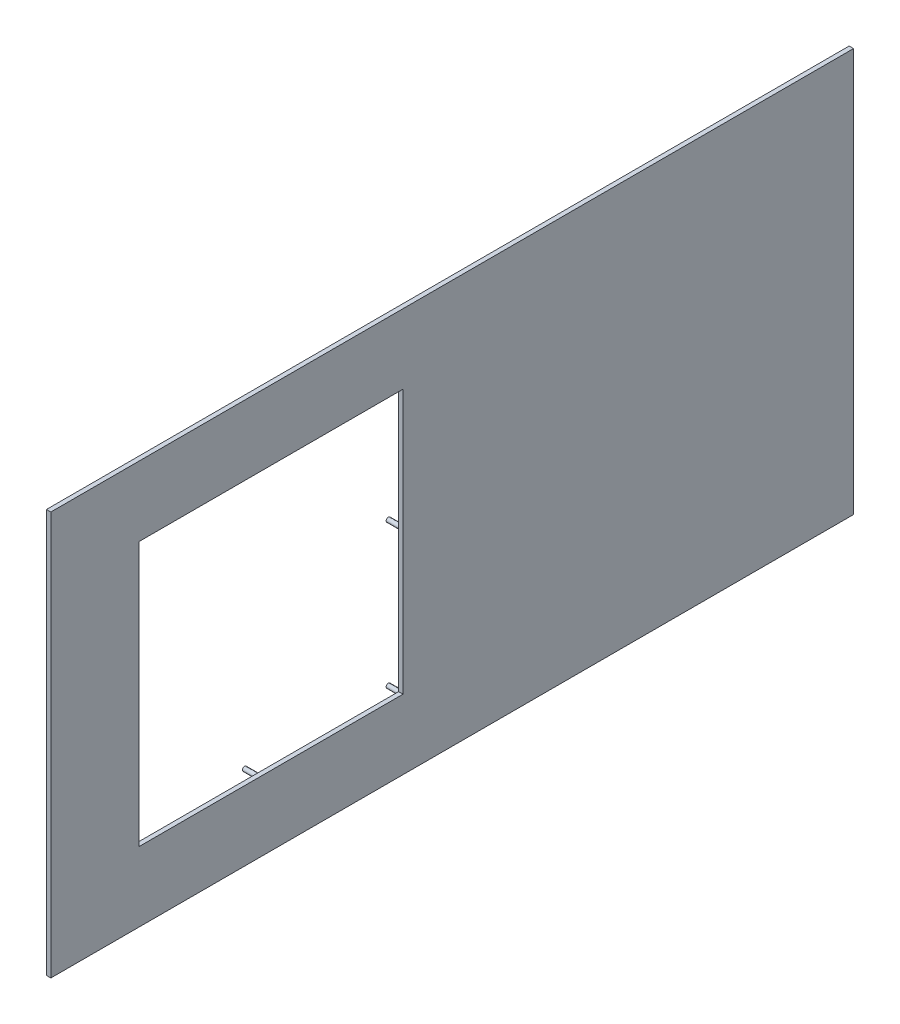
ISO-10303-21;
HEADER;
FILE_DESCRIPTION(('STEP AP214'),'2;1');
FILE_NAME('part.step','',(''),(''),'','','');
FILE_SCHEMA(('AUTOMOTIVE_DESIGN { 1 0 10303 214 1 1 1 1 }'));
ENDSEC;
DATA;
#1=APPLICATION_CONTEXT('core data for automotive mechanical design processes');
#2=APPLICATION_PROTOCOL_DEFINITION('international standard','automotive_design',2000,#1);
#3=PRODUCT_CONTEXT('',#1,'mechanical');
#4=PRODUCT('Part','Part','',(#3));
#5=PRODUCT_RELATED_PRODUCT_CATEGORY('part','',(#4));
#6=PRODUCT_DEFINITION_FORMATION('','',#4);
#7=PRODUCT_DEFINITION_CONTEXT('part definition',#1,'design');
#8=PRODUCT_DEFINITION('design','',#6,#7);
#9=PRODUCT_DEFINITION_SHAPE('','',#8);
#10=(LENGTH_UNIT() NAMED_UNIT(*) SI_UNIT(.MILLI.,.METRE.));
#11=(NAMED_UNIT(*) PLANE_ANGLE_UNIT() SI_UNIT($,.RADIAN.));
#12=(NAMED_UNIT(*) SI_UNIT($,.STERADIAN.) SOLID_ANGLE_UNIT());
#13=UNCERTAINTY_MEASURE_WITH_UNIT(LENGTH_MEASURE(1.E-05),#10,'distance_accuracy_value','');
#14=(GEOMETRIC_REPRESENTATION_CONTEXT(3) GLOBAL_UNCERTAINTY_ASSIGNED_CONTEXT((#13)) GLOBAL_UNIT_ASSIGNED_CONTEXT((#10,
#11,#12)) REPRESENTATION_CONTEXT('',''));
#15=CARTESIAN_POINT('',(0.,0.,0.));
#16=DIRECTION('',(0.,0.,1.));
#17=DIRECTION('',(1.,0.,0.));
#18=AXIS2_PLACEMENT_3D('',#15,#16,#17);
#19=CARTESIAN_POINT('',(3.,-137.5,-273.5));
#20=DIRECTION('',(0.,0.,1.));
#21=DIRECTION('',(1.,0.,0.));
#22=AXIS2_PLACEMENT_3D('',#19,#20,#21);
#23=PLANE('',#22);
#24=DIRECTION('',(0.,1.,0.));
#25=VECTOR('',#24,1.);
#26=CARTESIAN_POINT('',(0.,-137.5,-273.5));
#27=LINE('',#26,#25);
#28=CARTESIAN_POINT('',(0.,-137.5,-273.5));
#29=VERTEX_POINT('',#28);
#30=CARTESIAN_POINT('',(0.,137.5,-273.5));
#31=VERTEX_POINT('',#30);
#32=EDGE_CURVE('E151',#29,#31,#27,.T.);
#33=ORIENTED_EDGE('',*,*,#32,.T.);
#34=DIRECTION('',(-1.,0.,0.));
#35=VECTOR('',#34,1.);
#36=CARTESIAN_POINT('',(3.,137.5,-273.5));
#37=LINE('',#36,#35);
#38=CARTESIAN_POINT('',(3.,137.5,-273.5));
#39=VERTEX_POINT('',#38);
#40=EDGE_CURVE('E11',#39,#31,#37,.T.);
#41=ORIENTED_EDGE('',*,*,#40,.F.);
#42=DIRECTION('',(0.,1.,0.));
#43=VECTOR('',#42,1.);
#44=CARTESIAN_POINT('',(3.,-137.5,-273.5));
#45=LINE('',#44,#43);
#46=CARTESIAN_POINT('',(3.,-137.5,-273.5));
#47=VERTEX_POINT('',#46);
#48=EDGE_CURVE('E157',#47,#39,#45,.T.);
#49=ORIENTED_EDGE('',*,*,#48,.F.);
#50=DIRECTION('',(-1.,0.,0.));
#51=VECTOR('',#50,1.);
#52=CARTESIAN_POINT('',(3.,-137.5,-273.5));
#53=LINE('',#52,#51);
#54=EDGE_CURVE('E171',#47,#29,#53,.T.);
#55=ORIENTED_EDGE('',*,*,#54,.T.);
#56=EDGE_LOOP('',(#33,#41,#49,#55));
#57=FACE_BOUND('',#56,.T.);
#58=ADVANCED_FACE('F38',(#57),#23,.F.);
#59=CARTESIAN_POINT('',(3.,137.5,273.5));
#60=DIRECTION('',(0.,-1.,0.));
#61=DIRECTION('',(0.,0.,-1.));
#62=AXIS2_PLACEMENT_3D('',#59,#60,#61);
#63=PLANE('',#62);
#64=DIRECTION('',(0.,0.,1.));
#65=VECTOR('',#64,1.);
#66=CARTESIAN_POINT('',(0.,137.5,273.5));
#67=LINE('',#66,#65);
#68=CARTESIAN_POINT('',(0.,137.5,273.5));
#69=VERTEX_POINT('',#68);
#70=EDGE_CURVE('E175',#31,#69,#67,.T.);
#71=ORIENTED_EDGE('',*,*,#70,.T.);
#72=DIRECTION('',(-1.,0.,0.));
#73=VECTOR('',#72,1.);
#74=CARTESIAN_POINT('',(3.,137.5,273.5));
#75=LINE('',#74,#73);
#76=CARTESIAN_POINT('',(3.,137.5,273.5));
#77=VERTEX_POINT('',#76);
#78=EDGE_CURVE('E46',#77,#69,#75,.T.);
#79=ORIENTED_EDGE('',*,*,#78,.F.);
#80=DIRECTION('',(0.,0.,1.));
#81=VECTOR('',#80,1.);
#82=CARTESIAN_POINT('',(3.,137.5,273.5));
#83=LINE('',#82,#81);
#84=EDGE_CURVE('E161',#39,#77,#83,.T.);
#85=ORIENTED_EDGE('',*,*,#84,.F.);
#86=ORIENTED_EDGE('',*,*,#40,.T.);
#87=EDGE_LOOP('',(#71,#79,#85,#86));
#88=FACE_BOUND('',#87,.T.);
#89=ADVANCED_FACE('F210',(#88),#63,.F.);
#90=CARTESIAN_POINT('',(3.,-137.5,273.5));
#91=DIRECTION('',(0.,0.,-1.));
#92=DIRECTION('',(-1.,0.,0.));
#93=AXIS2_PLACEMENT_3D('',#90,#91,#92);
#94=PLANE('',#93);
#95=DIRECTION('',(0.,-1.,0.));
#96=VECTOR('',#95,1.);
#97=CARTESIAN_POINT('',(0.,-137.5,273.5));
#98=LINE('',#97,#96);
#99=CARTESIAN_POINT('',(0.,-137.5,273.5));
#100=VERTEX_POINT('',#99);
#101=EDGE_CURVE('E178',#69,#100,#98,.T.);
#102=ORIENTED_EDGE('',*,*,#101,.T.);
#103=DIRECTION('',(-1.,0.,0.));
#104=VECTOR('',#103,1.);
#105=CARTESIAN_POINT('',(3.,-137.5,273.5));
#106=LINE('',#105,#104);
#107=CARTESIAN_POINT('',(3.,-137.5,273.5));
#108=VERTEX_POINT('',#107);
#109=EDGE_CURVE('E186',#108,#100,#106,.T.);
#110=ORIENTED_EDGE('',*,*,#109,.F.);
#111=DIRECTION('',(0.,-1.,0.));
#112=VECTOR('',#111,1.);
#113=CARTESIAN_POINT('',(3.,-137.5,273.5));
#114=LINE('',#113,#112);
#115=EDGE_CURVE('E165',#77,#108,#114,.T.);
#116=ORIENTED_EDGE('',*,*,#115,.F.);
#117=ORIENTED_EDGE('',*,*,#78,.T.);
#118=EDGE_LOOP('',(#102,#110,#116,#117));
#119=FACE_BOUND('',#118,.T.);
#120=ADVANCED_FACE('F196',(#119),#94,.F.);
#121=CARTESIAN_POINT('',(3.,-137.5,273.5));
#122=DIRECTION('',(0.,1.,0.));
#123=DIRECTION('',(0.,0.,1.));
#124=AXIS2_PLACEMENT_3D('',#121,#122,#123);
#125=PLANE('',#124);
#126=DIRECTION('',(0.,0.,-1.));
#127=VECTOR('',#126,1.);
#128=CARTESIAN_POINT('',(0.,-137.5,273.5));
#129=LINE('',#128,#127);
#130=EDGE_CURVE('E162',#100,#29,#129,.T.);
#131=ORIENTED_EDGE('',*,*,#130,.T.);
#132=ORIENTED_EDGE('',*,*,#54,.F.);
#133=DIRECTION('',(0.,0.,-1.));
#134=VECTOR('',#133,1.);
#135=CARTESIAN_POINT('',(3.,-137.5,273.5));
#136=LINE('',#135,#134);
#137=EDGE_CURVE('E168',#108,#47,#136,.T.);
#138=ORIENTED_EDGE('',*,*,#137,.F.);
#139=ORIENTED_EDGE('',*,*,#109,.T.);
#140=EDGE_LOOP('',(#131,#132,#138,#139));
#141=FACE_BOUND('',#140,.T.);
#142=ADVANCED_FACE('F203',(#141),#125,.F.);
#143=CARTESIAN_POINT('',(3.,0.,0.));
#144=DIRECTION('',(-1.,0.,0.));
#145=DIRECTION('',(0.,0.,1.));
#146=AXIS2_PLACEMENT_3D('',#143,#144,#145);
#147=PLANE('',#146);
#148=DIRECTION('',(0.,0.,-1.));
#149=VECTOR('',#148,1.);
#150=CARTESIAN_POINT('',(3.,-90.0000000000001,213.5));
#151=LINE('',#150,#149);
#152=CARTESIAN_POINT('',(3.,-90.0000000000001,213.5));
#153=VERTEX_POINT('',#152);
#154=CARTESIAN_POINT('',(3.,-90.0000000000001,33.5000000000001));
#155=VERTEX_POINT('',#154);
#156=EDGE_CURVE('E141',#153,#155,#151,.T.);
#157=ORIENTED_EDGE('',*,*,#156,.F.);
#158=DIRECTION('',(0.,-1.,0.));
#159=VECTOR('',#158,1.);
#160=CARTESIAN_POINT('',(3.,-90.0000000000001,213.5));
#161=LINE('',#160,#159);
#162=CARTESIAN_POINT('',(3.,90.0000000000001,213.5));
#163=VERTEX_POINT('',#162);
#164=EDGE_CURVE('E53',#163,#153,#161,.T.);
#165=ORIENTED_EDGE('',*,*,#164,.F.);
#166=DIRECTION('',(0.,0.,1.));
#167=VECTOR('',#166,1.);
#168=CARTESIAN_POINT('',(3.,90.0000000000001,213.5));
#169=LINE('',#168,#167);
#170=CARTESIAN_POINT('',(3.,90.0000000000001,33.5000000000001));
#171=VERTEX_POINT('',#170);
#172=EDGE_CURVE('E124',#171,#163,#169,.T.);
#173=ORIENTED_EDGE('',*,*,#172,.F.);
#174=DIRECTION('',(0.,1.,0.));
#175=VECTOR('',#174,1.);
#176=CARTESIAN_POINT('',(3.,-90.0000000000001,33.5000000000001));
#177=LINE('',#176,#175);
#178=EDGE_CURVE('E129',#155,#171,#177,.T.);
#179=ORIENTED_EDGE('',*,*,#178,.F.);
#180=EDGE_LOOP('',(#157,#165,#173,#179));
#181=FACE_BOUND('',#180,.T.);
#182=ORIENTED_EDGE('',*,*,#48,.T.);
#183=ORIENTED_EDGE('',*,*,#84,.T.);
#184=ORIENTED_EDGE('',*,*,#115,.T.);
#185=ORIENTED_EDGE('',*,*,#137,.T.);
#186=EDGE_LOOP('',(#182,#183,#184,#185));
#187=FACE_BOUND('',#186,.T.);
#188=ADVANCED_FACE('F209',(#181,#187),#147,.F.);
#189=CARTESIAN_POINT('',(0.,0.,0.));
#190=DIRECTION('',(-1.,0.,0.));
#191=DIRECTION('',(0.,0.,1.));
#192=AXIS2_PLACEMENT_3D('',#189,#190,#191);
#193=PLANE('',#192);
#194=CARTESIAN_POINT('',(0.,0.,221.5));
#195=DIRECTION('',(-1.,0.,0.));
#196=DIRECTION('',(0.,0.,1.));
#197=AXIS2_PLACEMENT_3D('',#194,#195,#196);
#198=CIRCLE('',#197,1.5);
#199=CARTESIAN_POINT('',(0.,0.,223.));
#200=VERTEX_POINT('',#199);
#201=EDGE_CURVE('E307',#200,#200,#198,.T.);
#202=ORIENTED_EDGE('',*,*,#201,.F.);
#203=EDGE_LOOP('',(#202));
#204=FACE_BOUND('',#203,.T.);
#205=CARTESIAN_POINT('',(0.,0.,25.5000000000001));
#206=DIRECTION('',(-1.,0.,0.));
#207=DIRECTION('',(0.,0.,1.));
#208=AXIS2_PLACEMENT_3D('',#205,#206,#207);
#209=CIRCLE('',#208,1.5);
#210=CARTESIAN_POINT('',(0.,0.,27.0000000000001));
#211=VERTEX_POINT('',#210);
#212=EDGE_CURVE('E306',#211,#211,#209,.T.);
#213=ORIENTED_EDGE('',*,*,#212,.F.);
#214=EDGE_LOOP('',(#213));
#215=FACE_BOUND('',#214,.T.);
#216=CARTESIAN_POINT('',(0.,-98.0000000000001,25.5000000000001));
#217=DIRECTION('',(-1.,0.,0.));
#218=DIRECTION('',(0.,0.,1.));
#219=AXIS2_PLACEMENT_3D('',#216,#217,#218);
#220=CIRCLE('',#219,1.5);
#221=CARTESIAN_POINT('',(0.,-98.0000000000001,27.0000000000001));
#222=VERTEX_POINT('',#221);
#223=EDGE_CURVE('E320',#222,#222,#220,.T.);
#224=ORIENTED_EDGE('',*,*,#223,.F.);
#225=EDGE_LOOP('',(#224));
#226=FACE_BOUND('',#225,.T.);
#227=CARTESIAN_POINT('',(0.,-98.0000000000001,123.5));
#228=DIRECTION('',(-1.,0.,0.));
#229=DIRECTION('',(0.,0.,1.));
#230=AXIS2_PLACEMENT_3D('',#227,#228,#229);
#231=CIRCLE('',#230,1.49999999999997);
#232=CARTESIAN_POINT('',(0.,-98.0000000000001,125.));
#233=VERTEX_POINT('',#232);
#234=EDGE_CURVE('E326',#233,#233,#231,.T.);
#235=ORIENTED_EDGE('',*,*,#234,.F.);
#236=EDGE_LOOP('',(#235));
#237=FACE_BOUND('',#236,.T.);
#238=CARTESIAN_POINT('',(0.,98.0000000000001,221.5));
#239=DIRECTION('',(-1.,0.,0.));
#240=DIRECTION('',(0.,0.,1.));
#241=AXIS2_PLACEMENT_3D('',#238,#239,#240);
#242=CIRCLE('',#241,1.5);
#243=CARTESIAN_POINT('',(0.,98.0000000000001,223.));
#244=VERTEX_POINT('',#243);
#245=EDGE_CURVE('E334',#244,#244,#242,.T.);
#246=ORIENTED_EDGE('',*,*,#245,.F.);
#247=EDGE_LOOP('',(#246));
#248=FACE_BOUND('',#247,.T.);
#249=CARTESIAN_POINT('',(0.,-98.0000000000001,221.5));
#250=DIRECTION('',(-1.,0.,0.));
#251=DIRECTION('',(0.,0.,1.));
#252=AXIS2_PLACEMENT_3D('',#249,#250,#251);
#253=CIRCLE('',#252,1.5);
#254=CARTESIAN_POINT('',(0.,-98.0000000000001,223.));
#255=VERTEX_POINT('',#254);
#256=EDGE_CURVE('E342',#255,#255,#253,.T.);
#257=ORIENTED_EDGE('',*,*,#256,.F.);
#258=EDGE_LOOP('',(#257));
#259=FACE_BOUND('',#258,.T.);
#260=CARTESIAN_POINT('',(0.,98.0000000000001,123.5));
#261=DIRECTION('',(-1.,0.,0.));
#262=DIRECTION('',(0.,0.,1.));
#263=AXIS2_PLACEMENT_3D('',#260,#261,#262);
#264=CIRCLE('',#263,1.5);
#265=CARTESIAN_POINT('',(0.,98.0000000000001,125.));
#266=VERTEX_POINT('',#265);
#267=EDGE_CURVE('E350',#266,#266,#264,.T.);
#268=ORIENTED_EDGE('',*,*,#267,.F.);
#269=EDGE_LOOP('',(#268));
#270=FACE_BOUND('',#269,.T.);
#271=CARTESIAN_POINT('',(0.,97.9999999999999,25.5000000000001));
#272=DIRECTION('',(-1.,0.,0.));
#273=DIRECTION('',(0.,0.,1.));
#274=AXIS2_PLACEMENT_3D('',#271,#272,#273);
#275=CIRCLE('',#274,1.5);
#276=CARTESIAN_POINT('',(0.,97.9999999999999,27.0000000000001));
#277=VERTEX_POINT('',#276);
#278=EDGE_CURVE('E132',#277,#277,#275,.T.);
#279=ORIENTED_EDGE('',*,*,#278,.F.);
#280=EDGE_LOOP('',(#279));
#281=FACE_BOUND('',#280,.T.);
#282=DIRECTION('',(0.,-1.,0.));
#283=VECTOR('',#282,1.);
#284=CARTESIAN_POINT('',(0.,-90.0000000000001,213.5));
#285=LINE('',#284,#283);
#286=CARTESIAN_POINT('',(0.,90.0000000000001,213.5));
#287=VERTEX_POINT('',#286);
#288=CARTESIAN_POINT('',(0.,-90.0000000000001,213.5));
#289=VERTEX_POINT('',#288);
#290=EDGE_CURVE('E105',#287,#289,#285,.T.);
#291=ORIENTED_EDGE('',*,*,#290,.T.);
#292=DIRECTION('',(0.,0.,-1.));
#293=VECTOR('',#292,1.);
#294=CARTESIAN_POINT('',(0.,-90.0000000000001,213.5));
#295=LINE('',#294,#293);
#296=CARTESIAN_POINT('',(0.,-90.0000000000001,33.5000000000001));
#297=VERTEX_POINT('',#296);
#298=EDGE_CURVE('E115',#289,#297,#295,.T.);
#299=ORIENTED_EDGE('',*,*,#298,.T.);
#300=DIRECTION('',(0.,1.,0.));
#301=VECTOR('',#300,1.);
#302=CARTESIAN_POINT('',(0.,-90.0000000000001,33.5000000000001));
#303=LINE('',#302,#301);
#304=CARTESIAN_POINT('',(0.,90.0000000000001,33.5000000000001));
#305=VERTEX_POINT('',#304);
#306=EDGE_CURVE('E61',#297,#305,#303,.T.);
#307=ORIENTED_EDGE('',*,*,#306,.T.);
#308=DIRECTION('',(0.,0.,1.));
#309=VECTOR('',#308,1.);
#310=CARTESIAN_POINT('',(0.,90.0000000000001,213.5));
#311=LINE('',#310,#309);
#312=EDGE_CURVE('E112',#305,#287,#311,.T.);
#313=ORIENTED_EDGE('',*,*,#312,.T.);
#314=EDGE_LOOP('',(#291,#299,#307,#313));
#315=FACE_BOUND('',#314,.T.);
#316=ORIENTED_EDGE('',*,*,#32,.F.);
#317=ORIENTED_EDGE('',*,*,#130,.F.);
#318=ORIENTED_EDGE('',*,*,#101,.F.);
#319=ORIENTED_EDGE('',*,*,#70,.F.);
#320=EDGE_LOOP('',(#316,#317,#318,#319));
#321=FACE_BOUND('',#320,.T.);
#322=ADVANCED_FACE('F120',(#204,#215,#226,#237,#248,#259,#270,#281,#315,#321),#193,.T.);
#323=CARTESIAN_POINT('',(0.,-90.0000000000001,213.5));
#324=DIRECTION('',(0.,0.,1.));
#325=DIRECTION('',(1.,0.,0.));
#326=AXIS2_PLACEMENT_3D('',#323,#324,#325);
#327=PLANE('',#326);
#328=ORIENTED_EDGE('',*,*,#164,.T.);
#329=DIRECTION('',(1.,0.,0.));
#330=VECTOR('',#329,1.);
#331=CARTESIAN_POINT('',(0.,-90.0000000000001,213.5));
#332=LINE('',#331,#330);
#333=EDGE_CURVE('E101',#289,#153,#332,.T.);
#334=ORIENTED_EDGE('',*,*,#333,.F.);
#335=ORIENTED_EDGE('',*,*,#290,.F.);
#336=DIRECTION('',(1.,0.,0.));
#337=VECTOR('',#336,1.);
#338=CARTESIAN_POINT('',(0.,90.0000000000001,213.5));
#339=LINE('',#338,#337);
#340=EDGE_CURVE('E148',#287,#163,#339,.T.);
#341=ORIENTED_EDGE('',*,*,#340,.T.);
#342=EDGE_LOOP('',(#328,#334,#335,#341));
#343=FACE_BOUND('',#342,.T.);
#344=ADVANCED_FACE('F103',(#343),#327,.F.);
#345=CARTESIAN_POINT('',(0.,90.0000000000001,213.5));
#346=DIRECTION('',(0.,1.,0.));
#347=DIRECTION('',(0.,0.,1.));
#348=AXIS2_PLACEMENT_3D('',#345,#346,#347);
#349=PLANE('',#348);
#350=ORIENTED_EDGE('',*,*,#172,.T.);
#351=ORIENTED_EDGE('',*,*,#340,.F.);
#352=ORIENTED_EDGE('',*,*,#312,.F.);
#353=DIRECTION('',(1.,0.,0.));
#354=VECTOR('',#353,1.);
#355=CARTESIAN_POINT('',(0.,90.0000000000001,33.5000000000001));
#356=LINE('',#355,#354);
#357=EDGE_CURVE('E152',#305,#171,#356,.T.);
#358=ORIENTED_EDGE('',*,*,#357,.T.);
#359=EDGE_LOOP('',(#350,#351,#352,#358));
#360=FACE_BOUND('',#359,.T.);
#361=ADVANCED_FACE('F228',(#360),#349,.F.);
#362=CARTESIAN_POINT('',(0.,-90.0000000000001,33.5000000000001));
#363=DIRECTION('',(0.,0.,-1.));
#364=DIRECTION('',(-1.,0.,0.));
#365=AXIS2_PLACEMENT_3D('',#362,#363,#364);
#366=PLANE('',#365);
#367=ORIENTED_EDGE('',*,*,#178,.T.);
#368=ORIENTED_EDGE('',*,*,#357,.F.);
#369=ORIENTED_EDGE('',*,*,#306,.F.);
#370=DIRECTION('',(1.,0.,0.));
#371=VECTOR('',#370,1.);
#372=CARTESIAN_POINT('',(0.,-90.0000000000001,33.5000000000001));
#373=LINE('',#372,#371);
#374=EDGE_CURVE('E111',#297,#155,#373,.T.);
#375=ORIENTED_EDGE('',*,*,#374,.T.);
#376=EDGE_LOOP('',(#367,#368,#369,#375));
#377=FACE_BOUND('',#376,.T.);
#378=ADVANCED_FACE('F232',(#377),#366,.F.);
#379=CARTESIAN_POINT('',(0.,-90.0000000000001,213.5));
#380=DIRECTION('',(0.,-1.,0.));
#381=DIRECTION('',(0.,0.,-1.));
#382=AXIS2_PLACEMENT_3D('',#379,#380,#381);
#383=PLANE('',#382);
#384=ORIENTED_EDGE('',*,*,#156,.T.);
#385=ORIENTED_EDGE('',*,*,#374,.F.);
#386=ORIENTED_EDGE('',*,*,#298,.F.);
#387=ORIENTED_EDGE('',*,*,#333,.T.);
#388=EDGE_LOOP('',(#384,#385,#386,#387));
#389=FACE_BOUND('',#388,.T.);
#390=ADVANCED_FACE('F116',(#389),#383,.F.);
#391=CARTESIAN_POINT('',(-15.,97.9999999999999,25.5000000000001));
#392=DIRECTION('',(1.,0.,0.));
#393=DIRECTION('',(0.,0.,-1.));
#394=AXIS2_PLACEMENT_3D('',#391,#392,#393);
#395=CYLINDRICAL_SURFACE('',#394,1.5);
#396=CARTESIAN_POINT('',(-15.,97.9999999999999,25.5000000000001));
#397=DIRECTION('',(-1.,0.,0.));
#398=DIRECTION('',(0.,0.,1.));
#399=AXIS2_PLACEMENT_3D('',#396,#397,#398);
#400=CIRCLE('',#399,1.5);
#401=CARTESIAN_POINT('',(-15.,97.9999999999999,27.0000000000001));
#402=VERTEX_POINT('',#401);
#403=EDGE_CURVE('E142',#402,#402,#400,.T.);
#404=ORIENTED_EDGE('',*,*,#403,.F.);
#405=EDGE_LOOP('',(#404));
#406=FACE_BOUND('',#405,.T.);
#407=ORIENTED_EDGE('',*,*,#278,.T.);
#408=EDGE_LOOP('',(#407));
#409=FACE_BOUND('',#408,.T.);
#410=ADVANCED_FACE('F231',(#406,#409),#395,.T.);
#411=CARTESIAN_POINT('',(-15.,97.9999999999999,25.5000000000001));
#412=DIRECTION('',(-1.,0.,0.));
#413=DIRECTION('',(0.,0.,1.));
#414=AXIS2_PLACEMENT_3D('',#411,#412,#413);
#415=PLANE('',#414);
#416=ORIENTED_EDGE('',*,*,#403,.T.);
#417=EDGE_LOOP('',(#416));
#418=FACE_BOUND('',#417,.T.);
#419=ADVANCED_FACE('F240',(#418),#415,.T.);
#420=CARTESIAN_POINT('',(-15.,98.0000000000001,123.5));
#421=DIRECTION('',(1.,0.,0.));
#422=DIRECTION('',(0.,0.,-1.));
#423=AXIS2_PLACEMENT_3D('',#420,#421,#422);
#424=CYLINDRICAL_SURFACE('',#423,1.5);
#425=CARTESIAN_POINT('',(-15.,98.0000000000001,123.5));
#426=DIRECTION('',(-1.,0.,0.));
#427=DIRECTION('',(0.,0.,1.));
#428=AXIS2_PLACEMENT_3D('',#425,#426,#427);
#429=CIRCLE('',#428,1.5);
#430=CARTESIAN_POINT('',(-15.,98.0000000000001,125.));
#431=VERTEX_POINT('',#430);
#432=EDGE_CURVE('E354',#431,#431,#429,.T.);
#433=ORIENTED_EDGE('',*,*,#432,.F.);
#434=EDGE_LOOP('',(#433));
#435=FACE_BOUND('',#434,.T.);
#436=ORIENTED_EDGE('',*,*,#267,.T.);
#437=EDGE_LOOP('',(#436));
#438=FACE_BOUND('',#437,.T.);
#439=ADVANCED_FACE('F244',(#435,#438),#424,.T.);
#440=CARTESIAN_POINT('',(-15.,98.0000000000001,123.5));
#441=DIRECTION('',(-1.,0.,0.));
#442=DIRECTION('',(0.,0.,1.));
#443=AXIS2_PLACEMENT_3D('',#440,#441,#442);
#444=PLANE('',#443);
#445=ORIENTED_EDGE('',*,*,#432,.T.);
#446=EDGE_LOOP('',(#445));
#447=FACE_BOUND('',#446,.T.);
#448=ADVANCED_FACE('F248',(#447),#444,.T.);
#449=CARTESIAN_POINT('',(-15.,-98.0000000000001,221.5));
#450=DIRECTION('',(1.,0.,0.));
#451=DIRECTION('',(0.,0.,-1.));
#452=AXIS2_PLACEMENT_3D('',#449,#450,#451);
#453=CYLINDRICAL_SURFACE('',#452,1.5);
#454=CARTESIAN_POINT('',(-15.,-98.0000000000001,221.5));
#455=DIRECTION('',(-1.,0.,0.));
#456=DIRECTION('',(0.,0.,1.));
#457=AXIS2_PLACEMENT_3D('',#454,#455,#456);
#458=CIRCLE('',#457,1.5);
#459=CARTESIAN_POINT('',(-15.,-98.0000000000001,223.));
#460=VERTEX_POINT('',#459);
#461=EDGE_CURVE('E346',#460,#460,#458,.T.);
#462=ORIENTED_EDGE('',*,*,#461,.F.);
#463=EDGE_LOOP('',(#462));
#464=FACE_BOUND('',#463,.T.);
#465=ORIENTED_EDGE('',*,*,#256,.T.);
#466=EDGE_LOOP('',(#465));
#467=FACE_BOUND('',#466,.T.);
#468=ADVANCED_FACE('F252',(#464,#467),#453,.T.);
#469=CARTESIAN_POINT('',(-15.,-98.0000000000001,221.5));
#470=DIRECTION('',(-1.,0.,0.));
#471=DIRECTION('',(0.,0.,1.));
#472=AXIS2_PLACEMENT_3D('',#469,#470,#471);
#473=PLANE('',#472);
#474=ORIENTED_EDGE('',*,*,#461,.T.);
#475=EDGE_LOOP('',(#474));
#476=FACE_BOUND('',#475,.T.);
#477=ADVANCED_FACE('F256',(#476),#473,.T.);
#478=CARTESIAN_POINT('',(-15.,98.0000000000001,221.5));
#479=DIRECTION('',(1.,0.,0.));
#480=DIRECTION('',(0.,0.,-1.));
#481=AXIS2_PLACEMENT_3D('',#478,#479,#480);
#482=CYLINDRICAL_SURFACE('',#481,1.5);
#483=CARTESIAN_POINT('',(-15.,98.0000000000001,221.5));
#484=DIRECTION('',(-1.,0.,0.));
#485=DIRECTION('',(0.,0.,1.));
#486=AXIS2_PLACEMENT_3D('',#483,#484,#485);
#487=CIRCLE('',#486,1.5);
#488=CARTESIAN_POINT('',(-15.,98.0000000000001,223.));
#489=VERTEX_POINT('',#488);
#490=EDGE_CURVE('E338',#489,#489,#487,.T.);
#491=ORIENTED_EDGE('',*,*,#490,.F.);
#492=EDGE_LOOP('',(#491));
#493=FACE_BOUND('',#492,.T.);
#494=ORIENTED_EDGE('',*,*,#245,.T.);
#495=EDGE_LOOP('',(#494));
#496=FACE_BOUND('',#495,.T.);
#497=ADVANCED_FACE('F260',(#493,#496),#482,.T.);
#498=CARTESIAN_POINT('',(-15.,98.0000000000001,221.5));
#499=DIRECTION('',(-1.,0.,0.));
#500=DIRECTION('',(0.,0.,1.));
#501=AXIS2_PLACEMENT_3D('',#498,#499,#500);
#502=PLANE('',#501);
#503=ORIENTED_EDGE('',*,*,#490,.T.);
#504=EDGE_LOOP('',(#503));
#505=FACE_BOUND('',#504,.T.);
#506=ADVANCED_FACE('F264',(#505),#502,.T.);
#507=CARTESIAN_POINT('',(-15.,-98.0000000000001,123.5));
#508=DIRECTION('',(1.,0.,0.));
#509=DIRECTION('',(0.,0.,-1.));
#510=AXIS2_PLACEMENT_3D('',#507,#508,#509);
#511=CYLINDRICAL_SURFACE('',#510,1.49999999999997);
#512=CARTESIAN_POINT('',(-15.,-98.0000000000001,123.5));
#513=DIRECTION('',(-1.,0.,0.));
#514=DIRECTION('',(0.,0.,1.));
#515=AXIS2_PLACEMENT_3D('',#512,#513,#514);
#516=CIRCLE('',#515,1.49999999999997);
#517=CARTESIAN_POINT('',(-15.,-98.0000000000001,125.));
#518=VERTEX_POINT('',#517);
#519=EDGE_CURVE('E330',#518,#518,#516,.T.);
#520=ORIENTED_EDGE('',*,*,#519,.F.);
#521=EDGE_LOOP('',(#520));
#522=FACE_BOUND('',#521,.T.);
#523=ORIENTED_EDGE('',*,*,#234,.T.);
#524=EDGE_LOOP('',(#523));
#525=FACE_BOUND('',#524,.T.);
#526=ADVANCED_FACE('F268',(#522,#525),#511,.T.);
#527=CARTESIAN_POINT('',(-15.,-98.0000000000001,123.5));
#528=DIRECTION('',(-1.,0.,0.));
#529=DIRECTION('',(0.,0.,1.));
#530=AXIS2_PLACEMENT_3D('',#527,#528,#529);
#531=PLANE('',#530);
#532=ORIENTED_EDGE('',*,*,#519,.T.);
#533=EDGE_LOOP('',(#532));
#534=FACE_BOUND('',#533,.T.);
#535=ADVANCED_FACE('F272',(#534),#531,.T.);
#536=CARTESIAN_POINT('',(-15.,-98.0000000000001,25.5000000000001));
#537=DIRECTION('',(1.,0.,0.));
#538=DIRECTION('',(0.,0.,-1.));
#539=AXIS2_PLACEMENT_3D('',#536,#537,#538);
#540=CYLINDRICAL_SURFACE('',#539,1.5);
#541=CARTESIAN_POINT('',(-15.,-98.0000000000001,25.5000000000001));
#542=DIRECTION('',(-1.,0.,0.));
#543=DIRECTION('',(0.,0.,1.));
#544=AXIS2_PLACEMENT_3D('',#541,#542,#543);
#545=CIRCLE('',#544,1.5);
#546=CARTESIAN_POINT('',(-15.,-98.0000000000001,27.0000000000001));
#547=VERTEX_POINT('',#546);
#548=EDGE_CURVE('E322',#547,#547,#545,.T.);
#549=ORIENTED_EDGE('',*,*,#548,.F.);
#550=EDGE_LOOP('',(#549));
#551=FACE_BOUND('',#550,.T.);
#552=ORIENTED_EDGE('',*,*,#223,.T.);
#553=EDGE_LOOP('',(#552));
#554=FACE_BOUND('',#553,.T.);
#555=ADVANCED_FACE('F276',(#551,#554),#540,.T.);
#556=CARTESIAN_POINT('',(-15.,-98.0000000000001,25.5000000000001));
#557=DIRECTION('',(-1.,0.,0.));
#558=DIRECTION('',(0.,0.,1.));
#559=AXIS2_PLACEMENT_3D('',#556,#557,#558);
#560=PLANE('',#559);
#561=ORIENTED_EDGE('',*,*,#548,.T.);
#562=EDGE_LOOP('',(#561));
#563=FACE_BOUND('',#562,.T.);
#564=ADVANCED_FACE('F280',(#563),#560,.T.);
#565=CARTESIAN_POINT('',(-15.,0.,25.5000000000001));
#566=DIRECTION('',(1.,0.,0.));
#567=DIRECTION('',(0.,0.,-1.));
#568=AXIS2_PLACEMENT_3D('',#565,#566,#567);
#569=CYLINDRICAL_SURFACE('',#568,1.5);
#570=CARTESIAN_POINT('',(-15.,0.,25.5000000000001));
#571=DIRECTION('',(-1.,0.,0.));
#572=DIRECTION('',(0.,0.,1.));
#573=AXIS2_PLACEMENT_3D('',#570,#571,#572);
#574=CIRCLE('',#573,1.5);
#575=CARTESIAN_POINT('',(-15.,0.,27.0000000000001));
#576=VERTEX_POINT('',#575);
#577=EDGE_CURVE('E313',#576,#576,#574,.T.);
#578=ORIENTED_EDGE('',*,*,#577,.F.);
#579=EDGE_LOOP('',(#578));
#580=FACE_BOUND('',#579,.T.);
#581=ORIENTED_EDGE('',*,*,#212,.T.);
#582=EDGE_LOOP('',(#581));
#583=FACE_BOUND('',#582,.T.);
#584=ADVANCED_FACE('F284',(#580,#583),#569,.T.);
#585=CARTESIAN_POINT('',(-15.,0.,25.5000000000001));
#586=DIRECTION('',(-1.,0.,0.));
#587=DIRECTION('',(0.,0.,1.));
#588=AXIS2_PLACEMENT_3D('',#585,#586,#587);
#589=PLANE('',#588);
#590=ORIENTED_EDGE('',*,*,#577,.T.);
#591=EDGE_LOOP('',(#590));
#592=FACE_BOUND('',#591,.T.);
#593=ADVANCED_FACE('F288',(#592),#589,.T.);
#594=CARTESIAN_POINT('',(-15.,0.,221.5));
#595=DIRECTION('',(1.,0.,0.));
#596=DIRECTION('',(0.,0.,-1.));
#597=AXIS2_PLACEMENT_3D('',#594,#595,#596);
#598=CYLINDRICAL_SURFACE('',#597,1.5);
#599=CARTESIAN_POINT('',(-15.,0.,221.5));
#600=DIRECTION('',(-1.,0.,0.));
#601=DIRECTION('',(0.,0.,1.));
#602=AXIS2_PLACEMENT_3D('',#599,#600,#601);
#603=CIRCLE('',#602,1.5);
#604=CARTESIAN_POINT('',(-15.,0.,223.));
#605=VERTEX_POINT('',#604);
#606=EDGE_CURVE('E304',#605,#605,#603,.T.);
#607=ORIENTED_EDGE('',*,*,#606,.F.);
#608=EDGE_LOOP('',(#607));
#609=FACE_BOUND('',#608,.T.);
#610=ORIENTED_EDGE('',*,*,#201,.T.);
#611=EDGE_LOOP('',(#610));
#612=FACE_BOUND('',#611,.T.);
#613=ADVANCED_FACE('F292',(#609,#612),#598,.T.);
#614=CARTESIAN_POINT('',(-15.,0.,221.5));
#615=DIRECTION('',(-1.,0.,0.));
#616=DIRECTION('',(0.,0.,1.));
#617=AXIS2_PLACEMENT_3D('',#614,#615,#616);
#618=PLANE('',#617);
#619=ORIENTED_EDGE('',*,*,#606,.T.);
#620=EDGE_LOOP('',(#619));
#621=FACE_BOUND('',#620,.T.);
#622=ADVANCED_FACE('F296',(#621),#618,.T.);
#623=CLOSED_SHELL('',(#58,#89,#120,#142,#188,#322,#344,#361,#378,#390,#410,#419,#439,#448,#468,
#477,#497,#506,#526,#535,#555,#564,#584,#593,#613,#622));
#624=MANIFOLD_SOLID_BREP('B2',#623);
#625=ADVANCED_BREP_SHAPE_REPRESENTATION('',(#18,#624),#14);
#626=SHAPE_DEFINITION_REPRESENTATION(#9,#625);
ENDSEC;
END-ISO-10303-21;
